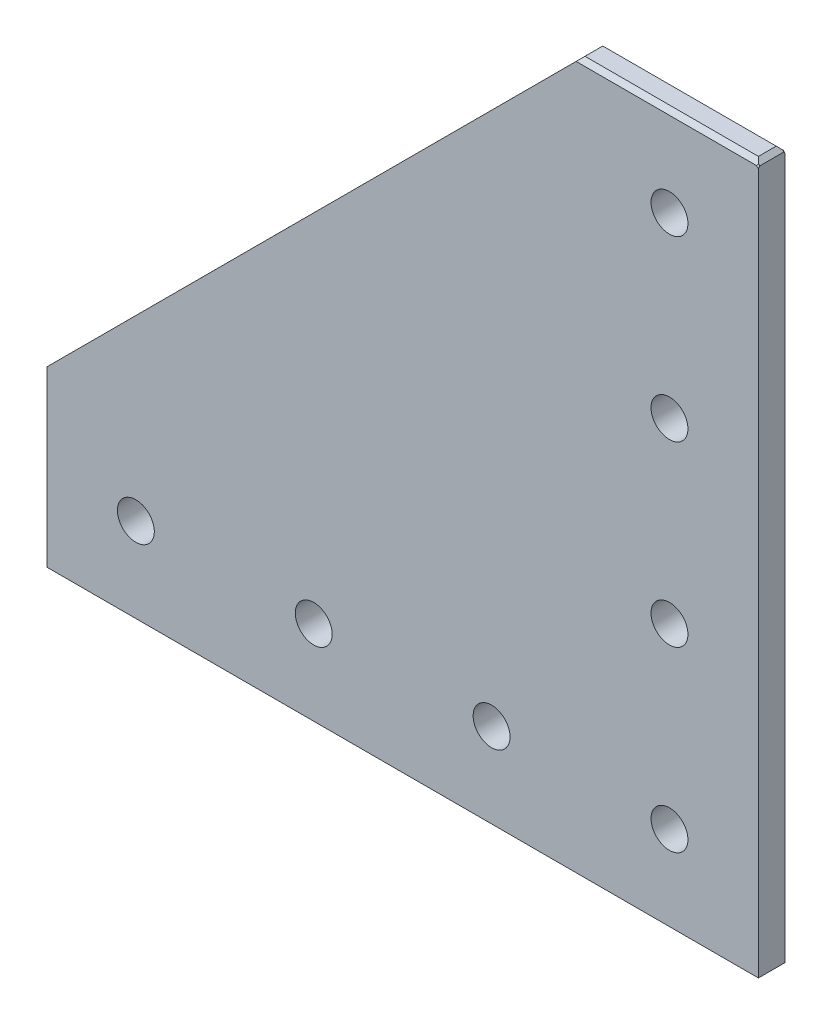
ISO-10303-21;
HEADER;
FILE_DESCRIPTION(('STEP AP214'),'2;1');
FILE_NAME('part.step','',(''),(''),'','','');
FILE_SCHEMA(('AUTOMOTIVE_DESIGN { 1 0 10303 214 1 1 1 1 }'));
ENDSEC;
DATA;
#1=APPLICATION_CONTEXT('core data for automotive mechanical design processes');
#2=APPLICATION_PROTOCOL_DEFINITION('international standard','automotive_design',2000,#1);
#3=PRODUCT_CONTEXT('',#1,'mechanical');
#4=PRODUCT('Part','Part','',(#3));
#5=PRODUCT_RELATED_PRODUCT_CATEGORY('part','',(#4));
#6=PRODUCT_DEFINITION_FORMATION('','',#4);
#7=PRODUCT_DEFINITION_CONTEXT('part definition',#1,'design');
#8=PRODUCT_DEFINITION('design','',#6,#7);
#9=PRODUCT_DEFINITION_SHAPE('','',#8);
#10=(LENGTH_UNIT() NAMED_UNIT(*) SI_UNIT(.MILLI.,.METRE.));
#11=(NAMED_UNIT(*) PLANE_ANGLE_UNIT() SI_UNIT($,.RADIAN.));
#12=(NAMED_UNIT(*) SI_UNIT($,.STERADIAN.) SOLID_ANGLE_UNIT());
#13=UNCERTAINTY_MEASURE_WITH_UNIT(LENGTH_MEASURE(1.E-05),#10,'distance_accuracy_value','');
#14=(GEOMETRIC_REPRESENTATION_CONTEXT(3) GLOBAL_UNCERTAINTY_ASSIGNED_CONTEXT((#13)) GLOBAL_UNIT_ASSIGNED_CONTEXT((#10,
#11,#12)) REPRESENTATION_CONTEXT('',''));
#15=CARTESIAN_POINT('',(0.,0.,0.));
#16=DIRECTION('',(0.,0.,1.));
#17=DIRECTION('',(1.,0.,0.));
#18=AXIS2_PLACEMENT_3D('',#15,#16,#17);
#19=CARTESIAN_POINT('',(-45.214020619,-78.014948454,-0.036));
#20=DIRECTION('',(-0.707106781186547,-0.707106781186547,0.));
#21=DIRECTION('',(0.707106781186547,-0.707106781186547,0.));
#22=AXIS2_PLACEMENT_3D('',#19,#20,#21);
#23=PLANE('',#22);
#24=DIRECTION('',(0.577350269285081,-0.577350269285081,0.577350268998715));
#25=VECTOR('',#24,1.);
#26=CARTESIAN_POINT('',(-45.214020619,-78.014948454,1.48799998337485E-09));
#27=LINE('',#26,#25);
#28=CARTESIAN_POINT('',(-45.214020619,-78.014948454,7.43999952723911E-10));
#29=VERTEX_POINT('',#28);
#30=CARTESIAN_POINT('',(-44.214020619,-79.014948454,1.000000000496));
#31=VERTEX_POINT('',#30);
#32=EDGE_CURVE('E20',#29,#31,#27,.T.);
#33=ORIENTED_EDGE('',*,*,#32,.T.);
#34=DIRECTION('',(0.,0.,1.));
#35=VECTOR('',#34,1.);
#36=CARTESIAN_POINT('',(-44.214020619,-79.014948454,3.));
#37=LINE('',#36,#35);
#38=CARTESIAN_POINT('',(-44.21402062572,-79.014948454,5.));
#39=VERTEX_POINT('',#38);
#40=EDGE_CURVE('E227',#31,#39,#37,.T.);
#41=ORIENTED_EDGE('',*,*,#40,.T.);
#42=DIRECTION('',(0.57735024874373,-0.577350279412574,-0.577350279412573));
#43=VECTOR('',#42,1.);
#44=CARTESIAN_POINT('',(-45.21402057932,-78.014948454,6.));
#45=LINE('',#44,#43);
#46=CARTESIAN_POINT('',(-45.21402059916,-78.014948454,6.));
#47=VERTEX_POINT('',#46);
#48=EDGE_CURVE('E214',#47,#39,#45,.T.);
#49=ORIENTED_EDGE('',*,*,#48,.F.);
#50=DIRECTION('',(0.,0.,1.));
#51=VECTOR('',#50,1.);
#52=CARTESIAN_POINT('',(-45.214020619,-78.014948454,3.));
#53=LINE('',#52,#51);
#54=EDGE_CURVE('E211',#29,#47,#53,.T.);
#55=ORIENTED_EDGE('',*,*,#54,.F.);
#56=EDGE_LOOP('',(#33,#41,#49,#55));
#57=FACE_BOUND('',#56,.T.);
#58=ADVANCED_FACE('F16',(#57),#23,.T.);
#59=CARTESIAN_POINT('',(-44.214020619,-79.014948454,1.));
#60=DIRECTION('',(0.,1.,0.));
#61=DIRECTION('',(0.,0.,1.));
#62=AXIS2_PLACEMENT_3D('',#59,#60,#61);
#63=PLANE('',#62);
#64=DIRECTION('',(0.,0.,1.));
#65=VECTOR('',#64,1.);
#66=CARTESIAN_POINT('',(113.785979381,-79.014948454,3.));
#67=LINE('',#66,#65);
#68=CARTESIAN_POINT('',(113.785979381,-79.014948454,1.00000000336001));
#69=VERTEX_POINT('',#68);
#70=CARTESIAN_POINT('',(113.78597938772,-79.014948454,5.));
#71=VERTEX_POINT('',#70);
#72=EDGE_CURVE('E221',#69,#71,#67,.T.);
#73=ORIENTED_EDGE('',*,*,#72,.T.);
#74=DIRECTION('',(1.,0.,0.));
#75=VECTOR('',#74,1.);
#76=CARTESIAN_POINT('',(34.785979381,-79.014948454,5.));
#77=LINE('',#76,#75);
#78=EDGE_CURVE('E219',#39,#71,#77,.T.);
#79=ORIENTED_EDGE('',*,*,#78,.F.);
#80=ORIENTED_EDGE('',*,*,#40,.F.);
#81=DIRECTION('',(1.,0.,0.));
#82=VECTOR('',#81,1.);
#83=CARTESIAN_POINT('',(34.785979381,-79.014948454,1.));
#84=LINE('',#83,#82);
#85=EDGE_CURVE('E208',#31,#69,#84,.T.);
#86=ORIENTED_EDGE('',*,*,#85,.T.);
#87=EDGE_LOOP('',(#73,#79,#80,#86));
#88=FACE_BOUND('',#87,.T.);
#89=ADVANCED_FACE('F261',(#88),#63,.F.);
#90=CARTESIAN_POINT('',(114.785979381,79.985051546,0.292893219));
#91=DIRECTION('',(0.707106781186547,0.707106781186547,0.));
#92=DIRECTION('',(-0.707106781186547,0.707106781186547,0.));
#93=AXIS2_PLACEMENT_3D('',#90,#91,#92);
#94=PLANE('',#93);
#95=DIRECTION('',(0.,0.,-1.));
#96=VECTOR('',#95,1.);
#97=CARTESIAN_POINT('',(113.785979381,80.985051546,3.));
#98=LINE('',#97,#96);
#99=CARTESIAN_POINT('',(113.785979381,80.985051546,4.9999999996406));
#100=VERTEX_POINT('',#99);
#101=CARTESIAN_POINT('',(113.785979381,80.985051546,0.999999998764435));
#102=VERTEX_POINT('',#101);
#103=EDGE_CURVE('E126',#100,#102,#98,.T.);
#104=ORIENTED_EDGE('',*,*,#103,.F.);
#105=DIRECTION('',(0.57735026913008,-0.57735026913008,0.577350269308717));
#106=VECTOR('',#105,1.);
#107=CARTESIAN_POINT('',(113.785979381719,80.9850515452812,5.));
#108=LINE('',#107,#106);
#109=CARTESIAN_POINT('',(114.493086162554,80.2779447647524,5.70710678123311));
#110=VERTEX_POINT('',#109);
#111=EDGE_CURVE('E122',#100,#110,#108,.T.);
#112=ORIENTED_EDGE('',*,*,#111,.T.);
#113=DIRECTION('',(-0.707106781266203,0.707106781106892,1.5289734027514E-10));
#114=VECTOR('',#113,1.);
#115=CARTESIAN_POINT('',(114.785979381258,79.9850515462169,5.70710678116977));
#116=LINE('',#115,#114);
#117=CARTESIAN_POINT('',(114.785979380339,79.9850515466783,5.70710678164939));
#118=VERTEX_POINT('',#117);
#119=EDGE_CURVE('E212',#118,#110,#116,.T.);
#120=ORIENTED_EDGE('',*,*,#119,.F.);
#121=DIRECTION('',(0.,0.,-1.));
#122=VECTOR('',#121,1.);
#123=CARTESIAN_POINT('',(114.785979381,79.985051546,3.));
#124=LINE('',#123,#122);
#125=CARTESIAN_POINT('',(114.785979381,79.985051546,0.292893218839367));
#126=VERTEX_POINT('',#125);
#127=EDGE_CURVE('E204',#118,#126,#124,.T.);
#128=ORIENTED_EDGE('',*,*,#127,.T.);
#129=DIRECTION('',(-0.707106781186547,0.707106781186547,0.));
#130=VECTOR('',#129,1.);
#131=CARTESIAN_POINT('',(114.285979381,80.485051546,0.292893219));
#132=LINE('',#131,#130);
#133=CARTESIAN_POINT('',(114.493086162354,80.2779447646464,0.292893218646441));
#134=VERTEX_POINT('',#133);
#135=EDGE_CURVE('E222',#126,#134,#132,.T.);
#136=ORIENTED_EDGE('',*,*,#135,.T.);
#137=DIRECTION('',(-0.577350269862182,0.577350269862182,0.577350267844513));
#138=VECTOR('',#137,1.);
#139=CARTESIAN_POINT('',(114.493086162,80.277944765,0.292893219));
#140=LINE('',#139,#138);
#141=EDGE_CURVE('E220',#134,#102,#140,.T.);
#142=ORIENTED_EDGE('',*,*,#141,.T.);
#143=EDGE_LOOP('',(#104,#112,#120,#128,#136,#142));
#144=FACE_BOUND('',#143,.T.);
#145=ADVANCED_FACE('F335',(#144),#94,.T.);
#146=CARTESIAN_POINT('',(114.785979381,-78.014948454,-0.036));
#147=DIRECTION('',(-0.707106781186547,0.707106781186547,0.));
#148=DIRECTION('',(-0.707106781186547,-0.707106781186547,0.));
#149=AXIS2_PLACEMENT_3D('',#146,#147,#148);
#150=PLANE('',#149);
#151=DIRECTION('',(0.,0.,1.));
#152=VECTOR('',#151,1.);
#153=CARTESIAN_POINT('',(114.785979381,-78.014948454,3.));
#154=LINE('',#153,#152);
#155=CARTESIAN_POINT('',(114.785979381,-78.014948454,-9.91999548911188E-09));
#156=VERTEX_POINT('',#155);
#157=CARTESIAN_POINT('',(114.78597936116,-78.014948454,6.));
#158=VERTEX_POINT('',#157);
#159=EDGE_CURVE('E200',#156,#158,#154,.T.);
#160=ORIENTED_EDGE('',*,*,#159,.T.);
#161=DIRECTION('',(0.577350248743725,0.577350279412576,0.577350279412576));
#162=VECTOR('',#161,1.);
#163=CARTESIAN_POINT('',(113.78597939444,-79.014948454,5.));
#164=LINE('',#163,#162);
#165=EDGE_CURVE('E217',#71,#158,#164,.T.);
#166=ORIENTED_EDGE('',*,*,#165,.F.);
#167=ORIENTED_EDGE('',*,*,#72,.F.);
#168=DIRECTION('',(0.577350264078151,0.577350264078151,-0.577350279412576));
#169=VECTOR('',#168,1.);
#170=CARTESIAN_POINT('',(113.78597938772,-79.01494844728,1.));
#171=LINE('',#170,#169);
#172=EDGE_CURVE('E205',#69,#156,#171,.T.);
#173=ORIENTED_EDGE('',*,*,#172,.T.);
#174=EDGE_LOOP('',(#160,#166,#167,#173));
#175=FACE_BOUND('',#174,.T.);
#176=ADVANCED_FACE('F285',(#175),#150,.F.);
#177=CARTESIAN_POINT('',(74.785979381,80.985051546,1.));
#178=DIRECTION('',(0.,1.,0.));
#179=DIRECTION('',(0.,0.,1.));
#180=AXIS2_PLACEMENT_3D('',#177,#178,#179);
#181=PLANE('',#180);
#182=ORIENTED_EDGE('',*,*,#103,.T.);
#183=DIRECTION('',(1.,0.,0.));
#184=VECTOR('',#183,1.);
#185=CARTESIAN_POINT('',(94.139455642,80.985051546,1.));
#186=LINE('',#185,#184);
#187=CARTESIAN_POINT('',(74.7859793804999,80.985051546,1.));
#188=VERTEX_POINT('',#187);
#189=EDGE_CURVE('E136',#188,#102,#186,.T.);
#190=ORIENTED_EDGE('',*,*,#189,.F.);
#191=DIRECTION('',(0.,0.,1.));
#192=VECTOR('',#191,1.);
#193=CARTESIAN_POINT('',(74.785979381,80.985051546,3.));
#194=LINE('',#193,#192);
#195=CARTESIAN_POINT('',(74.7859793804999,80.985051546,5.));
#196=VERTEX_POINT('',#195);
#197=EDGE_CURVE('E129',#188,#196,#194,.T.);
#198=ORIENTED_EDGE('',*,*,#197,.T.);
#199=DIRECTION('',(1.,0.,0.));
#200=VECTOR('',#199,1.);
#201=CARTESIAN_POINT('',(94.139455642,80.985051546,5.));
#202=LINE('',#201,#200);
#203=EDGE_CURVE('E114',#196,#100,#202,.T.);
#204=ORIENTED_EDGE('',*,*,#203,.T.);
#205=EDGE_LOOP('',(#182,#190,#198,#204));
#206=FACE_BOUND('',#205,.T.);
#207=ADVANCED_FACE('F134',(#206),#181,.T.);
#208=CARTESIAN_POINT('',(73.785825121,79.985051546,6.));
#209=DIRECTION('',(0.,-0.707106781186547,-0.707106781186548));
#210=DIRECTION('',(0.,0.707106781186548,-0.707106781186547));
#211=AXIS2_PLACEMENT_3D('',#208,#209,#210);
#212=PLANE('',#211);
#213=DIRECTION('',(-1.,0.,0.));
#214=VECTOR('',#213,1.);
#215=CARTESIAN_POINT('',(34.785979381,79.985051546,6.));
#216=LINE('',#215,#214);
#217=CARTESIAN_POINT('',(114.37176580016,79.9850515460686,6.00000000006861));
#218=VERTEX_POINT('',#217);
#219=CARTESIAN_POINT('',(73.7858251259561,79.985051546,6.));
#220=VERTEX_POINT('',#219);
#221=EDGE_CURVE('E144',#218,#220,#216,.T.);
#222=ORIENTED_EDGE('',*,*,#221,.F.);
#223=DIRECTION('',(-0.281084636299855,-0.678598344630526,0.678598345047266));
#224=VECTOR('',#223,1.);
#225=CARTESIAN_POINT('',(114.493086162273,80.2779447651359,5.7071067812331));
#226=LINE('',#225,#224);
#227=EDGE_CURVE('E209',#110,#218,#226,.T.);
#228=ORIENTED_EDGE('',*,*,#227,.F.);
#229=ORIENTED_EDGE('',*,*,#111,.F.);
#230=ORIENTED_EDGE('',*,*,#203,.F.);
#231=DIRECTION('',(-0.577409642809244,-0.577320580089998,0.577320580089996));
#232=VECTOR('',#231,1.);
#233=CARTESIAN_POINT('',(74.785979381,80.985051547,4.999999999));
#234=LINE('',#233,#232);
#235=EDGE_CURVE('E118',#196,#220,#234,.T.);
#236=ORIENTED_EDGE('',*,*,#235,.T.);
#237=EDGE_LOOP('',(#222,#228,#229,#230,#236));
#238=FACE_BOUND('',#237,.T.);
#239=ADVANCED_FACE('F117',(#238),#212,.F.);
#240=CARTESIAN_POINT('',(-46.174020619,-78.014948454,6.));
#241=DIRECTION('',(0.,-0.707106781186547,0.707106781186548));
#242=DIRECTION('',(0.,-0.707106781186548,-0.707106781186547));
#243=AXIS2_PLACEMENT_3D('',#240,#241,#242);
#244=PLANE('',#243);
#245=DIRECTION('',(1.,0.,0.));
#246=VECTOR('',#245,1.);
#247=CARTESIAN_POINT('',(34.785979381,-78.014948454,6.));
#248=LINE('',#247,#246);
#249=EDGE_CURVE('E238',#47,#158,#248,.T.);
#250=ORIENTED_EDGE('',*,*,#249,.F.);
#251=ORIENTED_EDGE('',*,*,#48,.T.);
#252=ORIENTED_EDGE('',*,*,#78,.T.);
#253=ORIENTED_EDGE('',*,*,#165,.T.);
#254=EDGE_LOOP('',(#250,#251,#252,#253));
#255=FACE_BOUND('',#254,.T.);
#256=ADVANCED_FACE('F287',(#255),#244,.T.);
#257=CARTESIAN_POINT('',(114.689419376,80.282187406,5.565278234));
#258=DIRECTION('',(0.500000000555556,0.500000000515327,0.707106780429319));
#259=DIRECTION('',(-0.816496580333862,0.,0.577350270029476));
#260=AXIS2_PLACEMENT_3D('',#257,#258,#259);
#261=PLANE('',#260);
#262=ORIENTED_EDGE('',*,*,#227,.T.);
#263=DIRECTION('',(-0.707106789722082,0.707106772651014,0.));
#264=VECTOR('',#263,1.);
#265=CARTESIAN_POINT('',(114.785979381,79.570837956,6.));
#266=LINE('',#265,#264);
#267=CARTESIAN_POINT('',(114.785979382809,79.5708379668556,6.));
#268=VERTEX_POINT('',#267);
#269=EDGE_CURVE('E190',#268,#218,#266,.T.);
#270=ORIENTED_EDGE('',*,*,#269,.F.);
#271=DIRECTION('',(-1.60042415972101E-08,0.816496585690512,-0.577350262454029));
#272=VECTOR('',#271,1.);
#273=CARTESIAN_POINT('',(114.785979388237,79.5708379632371,6.00000001023475));
#274=LINE('',#273,#272);
#275=EDGE_CURVE('E201',#268,#118,#274,.T.);
#276=ORIENTED_EDGE('',*,*,#275,.T.);
#277=ORIENTED_EDGE('',*,*,#119,.T.);
#278=EDGE_LOOP('',(#262,#270,#276,#277));
#279=FACE_BOUND('',#278,.T.);
#280=ADVANCED_FACE('F281',(#279),#261,.T.);
#281=CARTESIAN_POINT('',(-45.214020619,-78.014948454,0.));
#282=DIRECTION('',(-1.,0.,0.));
#283=DIRECTION('',(0.,0.,1.));
#284=AXIS2_PLACEMENT_3D('',#281,#282,#283);
#285=PLANE('',#284);
#286=ORIENTED_EDGE('',*,*,#54,.T.);
#287=DIRECTION('',(0.,-1.,0.));
#288=VECTOR('',#287,1.);
#289=CARTESIAN_POINT('',(-45.214020619,0.985051545999996,6.));
#290=LINE('',#289,#288);
#291=CARTESIAN_POINT('',(-45.214020619,-38.996440056,6.));
#292=VERTEX_POINT('',#291);
#293=EDGE_CURVE('E194',#292,#47,#290,.T.);
#294=ORIENTED_EDGE('',*,*,#293,.F.);
#295=DIRECTION('',(0.,0.,-1.));
#296=VECTOR('',#295,1.);
#297=CARTESIAN_POINT('',(-45.214020619,-38.996440088,3.));
#298=LINE('',#297,#296);
#299=CARTESIAN_POINT('',(-45.214020619,-38.996440088,0.));
#300=VERTEX_POINT('',#299);
#301=EDGE_CURVE('E132',#292,#300,#298,.T.);
#302=ORIENTED_EDGE('',*,*,#301,.T.);
#303=DIRECTION('',(0.,-1.,0.));
#304=VECTOR('',#303,1.);
#305=CARTESIAN_POINT('',(-45.214020619,0.985051545999996,0.));
#306=LINE('',#305,#304);
#307=EDGE_CURVE('E105',#300,#29,#306,.T.);
#308=ORIENTED_EDGE('',*,*,#307,.T.);
#309=EDGE_LOOP('',(#286,#294,#302,#308));
#310=FACE_BOUND('',#309,.T.);
#311=ADVANCED_FACE('F270',(#310),#285,.T.);
#312=CARTESIAN_POINT('',(-46.174020619,-78.014948454,0.));
#313=DIRECTION('',(0.,0.707106781186547,0.707106781186548));
#314=DIRECTION('',(0.,-0.707106781186548,0.707106781186547));
#315=AXIS2_PLACEMENT_3D('',#312,#313,#314);
#316=PLANE('',#315);
#317=ORIENTED_EDGE('',*,*,#172,.F.);
#318=ORIENTED_EDGE('',*,*,#85,.F.);
#319=ORIENTED_EDGE('',*,*,#32,.F.);
#320=DIRECTION('',(1.,0.,0.));
#321=VECTOR('',#320,1.);
#322=CARTESIAN_POINT('',(34.785979381,-78.014948454,0.));
#323=LINE('',#322,#321);
#324=EDGE_CURVE('E249',#29,#156,#323,.T.);
#325=ORIENTED_EDGE('',*,*,#324,.T.);
#326=EDGE_LOOP('',(#317,#318,#319,#325));
#327=FACE_BOUND('',#326,.T.);
#328=ADVANCED_FACE('F264',(#327),#316,.F.);
#329=CARTESIAN_POINT('',(114.785979381,-78.014948454,0.));
#330=DIRECTION('',(-1.,0.,0.));
#331=DIRECTION('',(0.,0.,1.));
#332=AXIS2_PLACEMENT_3D('',#329,#330,#331);
#333=PLANE('',#332);
#334=ORIENTED_EDGE('',*,*,#159,.F.);
#335=DIRECTION('',(0.,1.,0.));
#336=VECTOR('',#335,1.);
#337=CARTESIAN_POINT('',(114.785979381,0.985051545999996,0.));
#338=LINE('',#337,#336);
#339=CARTESIAN_POINT('',(114.785979381064,79.5708379770083,-5.02701323886911E-09));
#340=VERTEX_POINT('',#339);
#341=EDGE_CURVE('E171',#156,#340,#338,.T.);
#342=ORIENTED_EDGE('',*,*,#341,.T.);
#343=DIRECTION('',(0.,0.816496580856449,0.577350269290426));
#344=VECTOR('',#343,1.);
#345=CARTESIAN_POINT('',(114.785979381,79.5708379838651,-4.30068730871954E-11));
#346=LINE('',#345,#344);
#347=EDGE_CURVE('E197',#340,#126,#346,.T.);
#348=ORIENTED_EDGE('',*,*,#347,.T.);
#349=ORIENTED_EDGE('',*,*,#127,.F.);
#350=ORIENTED_EDGE('',*,*,#275,.F.);
#351=DIRECTION('',(0.,1.,0.));
#352=VECTOR('',#351,1.);
#353=CARTESIAN_POINT('',(114.785979381,0.985051545999996,6.));
#354=LINE('',#353,#352);
#355=EDGE_CURVE('E193',#158,#268,#354,.T.);
#356=ORIENTED_EDGE('',*,*,#355,.F.);
#357=EDGE_LOOP('',(#334,#342,#348,#349,#350,#356));
#358=FACE_BOUND('',#357,.T.);
#359=ADVANCED_FACE('F277',(#358),#333,.F.);
#360=CARTESIAN_POINT('',(114.689419376,80.282187406,0.434721766));
#361=DIRECTION('',(-0.500000000555556,-0.500000000515327,0.707106780429319));
#362=DIRECTION('',(-0.816496580333862,0.,-0.577350270029476));
#363=AXIS2_PLACEMENT_3D('',#360,#361,#362);
#364=PLANE('',#363);
#365=ORIENTED_EDGE('',*,*,#135,.F.);
#366=ORIENTED_EDGE('',*,*,#347,.F.);
#367=DIRECTION('',(-0.707106785440088,0.707106776933007,-6.05565015488946E-09));
#368=VECTOR('',#367,1.);
#369=CARTESIAN_POINT('',(114.785979388237,79.5708379632371,-1.02347482160321E-08));
#370=LINE('',#369,#368);
#371=CARTESIAN_POINT('',(114.37176581246,79.985051546,-3.44551667145939E-09));
#372=VERTEX_POINT('',#371);
#373=EDGE_CURVE('E168',#340,#372,#370,.T.);
#374=ORIENTED_EDGE('',*,*,#373,.T.);
#375=DIRECTION('',(-0.281084626904209,-0.678598346784799,-0.678598346784797));
#376=VECTOR('',#375,1.);
#377=CARTESIAN_POINT('',(114.493086163,80.277944765,0.292893219000001));
#378=LINE('',#377,#376);
#379=EDGE_CURVE('E138',#134,#372,#378,.T.);
#380=ORIENTED_EDGE('',*,*,#379,.F.);
#381=EDGE_LOOP('',(#365,#366,#374,#380));
#382=FACE_BOUND('',#381,.T.);
#383=ADVANCED_FACE('F275',(#382),#364,.F.);
#384=CARTESIAN_POINT('',(73.785825121,79.985051546,0.));
#385=DIRECTION('',(0.,0.707106781186547,-0.707106781186548));
#386=DIRECTION('',(0.,0.707106781186548,0.707106781186547));
#387=AXIS2_PLACEMENT_3D('',#384,#385,#386);
#388=PLANE('',#387);
#389=ORIENTED_EDGE('',*,*,#379,.T.);
#390=DIRECTION('',(-1.,0.,0.));
#391=VECTOR('',#390,1.);
#392=CARTESIAN_POINT('',(34.785979381,79.985051546,0.));
#393=LINE('',#392,#391);
#394=CARTESIAN_POINT('',(73.7858251158681,79.985051546,0.));
#395=VERTEX_POINT('',#394);
#396=EDGE_CURVE('E142',#372,#395,#393,.T.);
#397=ORIENTED_EDGE('',*,*,#396,.T.);
#398=DIRECTION('',(0.577409642809244,0.577320580089998,0.577320580089996));
#399=VECTOR('',#398,1.);
#400=CARTESIAN_POINT('',(73.785825101,79.9850515360895,-9.91054460719453E-09));
#401=LINE('',#400,#399);
#402=EDGE_CURVE('E35',#395,#188,#401,.T.);
#403=ORIENTED_EDGE('',*,*,#402,.T.);
#404=ORIENTED_EDGE('',*,*,#189,.T.);
#405=ORIENTED_EDGE('',*,*,#141,.F.);
#406=EDGE_LOOP('',(#389,#397,#403,#404,#405));
#407=FACE_BOUND('',#406,.T.);
#408=ADVANCED_FACE('F273',(#407),#388,.T.);
#409=CARTESIAN_POINT('',(-45.214020619,-38.996440088,0.));
#410=DIRECTION('',(0.707052244081806,-0.707161314085324,0.));
#411=DIRECTION('',(0.707161314085324,0.707052244081806,0.));
#412=AXIS2_PLACEMENT_3D('',#409,#410,#411);
#413=PLANE('',#412);
#414=DIRECTION('',(-0.707161314335424,-0.707052243831667,0.));
#415=VECTOR('',#414,1.);
#416=CARTESIAN_POINT('',(73.7858251410001,79.985051546,6.));
#417=LINE('',#416,#415);
#418=EDGE_CURVE('E131',#220,#292,#417,.T.);
#419=ORIENTED_EDGE('',*,*,#418,.F.);
#420=ORIENTED_EDGE('',*,*,#235,.F.);
#421=ORIENTED_EDGE('',*,*,#197,.F.);
#422=ORIENTED_EDGE('',*,*,#402,.F.);
#423=DIRECTION('',(0.707161314085324,0.707052244081806,0.));
#424=VECTOR('',#423,1.);
#425=CARTESIAN_POINT('',(-45.214020619,-38.996440088,0.));
#426=LINE('',#425,#424);
#427=EDGE_CURVE('E166',#395,#300,#426,.F.);
#428=ORIENTED_EDGE('',*,*,#427,.T.);
#429=ORIENTED_EDGE('',*,*,#301,.F.);
#430=EDGE_LOOP('',(#419,#420,#421,#422,#428,#429));
#431=FACE_BOUND('',#430,.T.);
#432=ADVANCED_FACE('F128',(#431),#413,.F.);
#433=CARTESIAN_POINT('',(-25.214020619,-59.014948454,6.));
#434=DIRECTION('',(0.,0.,-1.));
#435=DIRECTION('',(-1.,0.,0.));
#436=AXIS2_PLACEMENT_3D('',#433,#434,#435);
#437=CYLINDRICAL_SURFACE('',#436,4.15);
#438=CARTESIAN_POINT('',(-25.214020619,-59.014948454,0.));
#439=DIRECTION('',(0.,0.,-1.));
#440=DIRECTION('',(-1.,0.,0.));
#441=AXIS2_PLACEMENT_3D('',#438,#439,#440);
#442=CIRCLE('',#441,4.15);
#443=CARTESIAN_POINT('',(-29.364020619,-59.014948454,0.));
#444=VERTEX_POINT('',#443);
#445=EDGE_CURVE('E163',#444,#444,#442,.T.);
#446=ORIENTED_EDGE('',*,*,#445,.T.);
#447=EDGE_LOOP('',(#446));
#448=FACE_BOUND('',#447,.T.);
#449=CARTESIAN_POINT('',(-25.214020619,-59.014948454,6.));
#450=DIRECTION('',(0.,0.,-1.));
#451=DIRECTION('',(-1.,0.,0.));
#452=AXIS2_PLACEMENT_3D('',#449,#450,#451);
#453=CIRCLE('',#452,4.15);
#454=CARTESIAN_POINT('',(-29.364020619,-59.014948454,6.));
#455=VERTEX_POINT('',#454);
#456=EDGE_CURVE('E187',#455,#455,#453,.T.);
#457=ORIENTED_EDGE('',*,*,#456,.F.);
#458=EDGE_LOOP('',(#457));
#459=FACE_BOUND('',#458,.T.);
#460=ADVANCED_FACE('F326',(#448,#459),#437,.F.);
#461=CARTESIAN_POINT('',(54.785979381,-59.014948454,6.));
#462=DIRECTION('',(0.,0.,-1.));
#463=DIRECTION('',(-1.,0.,0.));
#464=AXIS2_PLACEMENT_3D('',#461,#462,#463);
#465=CYLINDRICAL_SURFACE('',#464,4.15);
#466=CARTESIAN_POINT('',(54.785979381,-59.014948454,0.));
#467=DIRECTION('',(0.,0.,-1.));
#468=DIRECTION('',(-1.,0.,0.));
#469=AXIS2_PLACEMENT_3D('',#466,#467,#468);
#470=CIRCLE('',#469,4.15);
#471=CARTESIAN_POINT('',(50.635979381,-59.014948454,0.));
#472=VERTEX_POINT('',#471);
#473=EDGE_CURVE('E160',#472,#472,#470,.T.);
#474=ORIENTED_EDGE('',*,*,#473,.T.);
#475=EDGE_LOOP('',(#474));
#476=FACE_BOUND('',#475,.T.);
#477=CARTESIAN_POINT('',(54.785979381,-59.014948454,6.));
#478=DIRECTION('',(0.,0.,-1.));
#479=DIRECTION('',(-1.,0.,0.));
#480=AXIS2_PLACEMENT_3D('',#477,#478,#479);
#481=CIRCLE('',#480,4.15);
#482=CARTESIAN_POINT('',(50.635979381,-59.014948454,6.));
#483=VERTEX_POINT('',#482);
#484=EDGE_CURVE('E184',#483,#483,#481,.T.);
#485=ORIENTED_EDGE('',*,*,#484,.F.);
#486=EDGE_LOOP('',(#485));
#487=FACE_BOUND('',#486,.T.);
#488=ADVANCED_FACE('F322',(#476,#487),#465,.F.);
#489=CARTESIAN_POINT('',(14.785979381,-59.014948454,6.));
#490=DIRECTION('',(0.,0.,-1.));
#491=DIRECTION('',(-1.,0.,0.));
#492=AXIS2_PLACEMENT_3D('',#489,#490,#491);
#493=CYLINDRICAL_SURFACE('',#492,4.15);
#494=CARTESIAN_POINT('',(14.785979381,-59.014948454,0.));
#495=DIRECTION('',(0.,0.,-1.));
#496=DIRECTION('',(-1.,0.,0.));
#497=AXIS2_PLACEMENT_3D('',#494,#495,#496);
#498=CIRCLE('',#497,4.15);
#499=CARTESIAN_POINT('',(10.635979381,-59.014948454,0.));
#500=VERTEX_POINT('',#499);
#501=EDGE_CURVE('E157',#500,#500,#498,.T.);
#502=ORIENTED_EDGE('',*,*,#501,.T.);
#503=EDGE_LOOP('',(#502));
#504=FACE_BOUND('',#503,.T.);
#505=CARTESIAN_POINT('',(14.785979381,-59.014948454,6.));
#506=DIRECTION('',(0.,0.,-1.));
#507=DIRECTION('',(-1.,0.,0.));
#508=AXIS2_PLACEMENT_3D('',#505,#506,#507);
#509=CIRCLE('',#508,4.15);
#510=CARTESIAN_POINT('',(10.635979381,-59.014948454,6.));
#511=VERTEX_POINT('',#510);
#512=EDGE_CURVE('E181',#511,#511,#509,.T.);
#513=ORIENTED_EDGE('',*,*,#512,.F.);
#514=EDGE_LOOP('',(#513));
#515=FACE_BOUND('',#514,.T.);
#516=ADVANCED_FACE('F318',(#504,#515),#493,.F.);
#517=CARTESIAN_POINT('',(94.785979381,20.985051546,6.));
#518=DIRECTION('',(0.,0.,-1.));
#519=DIRECTION('',(-1.,0.,0.));
#520=AXIS2_PLACEMENT_3D('',#517,#518,#519);
#521=CYLINDRICAL_SURFACE('',#520,4.15000000000001);
#522=CARTESIAN_POINT('',(94.785979381,20.985051546,6.));
#523=DIRECTION('',(0.,0.,-1.));
#524=DIRECTION('',(-1.,0.,0.));
#525=AXIS2_PLACEMENT_3D('',#522,#523,#524);
#526=CIRCLE('',#525,4.15000000000001);
#527=CARTESIAN_POINT('',(90.635979381,20.985051546,6.));
#528=VERTEX_POINT('',#527);
#529=EDGE_CURVE('E178',#528,#528,#526,.T.);
#530=ORIENTED_EDGE('',*,*,#529,.F.);
#531=EDGE_LOOP('',(#530));
#532=FACE_BOUND('',#531,.T.);
#533=CARTESIAN_POINT('',(94.785979381,20.985051546,0.));
#534=DIRECTION('',(0.,0.,-1.));
#535=DIRECTION('',(-1.,0.,0.));
#536=AXIS2_PLACEMENT_3D('',#533,#534,#535);
#537=CIRCLE('',#536,4.15000000000001);
#538=CARTESIAN_POINT('',(90.635979381,20.985051546,0.));
#539=VERTEX_POINT('',#538);
#540=EDGE_CURVE('E154',#539,#539,#537,.T.);
#541=ORIENTED_EDGE('',*,*,#540,.T.);
#542=EDGE_LOOP('',(#541));
#543=FACE_BOUND('',#542,.T.);
#544=ADVANCED_FACE('F314',(#532,#543),#521,.F.);
#545=CARTESIAN_POINT('',(94.785979381,-19.014948454,6.));
#546=DIRECTION('',(0.,0.,-1.));
#547=DIRECTION('',(-1.,0.,0.));
#548=AXIS2_PLACEMENT_3D('',#545,#546,#547);
#549=CYLINDRICAL_SURFACE('',#548,4.15000000000001);
#550=CARTESIAN_POINT('',(94.785979381,-19.014948454,6.));
#551=DIRECTION('',(0.,0.,-1.));
#552=DIRECTION('',(-1.,0.,0.));
#553=AXIS2_PLACEMENT_3D('',#550,#551,#552);
#554=CIRCLE('',#553,4.15000000000001);
#555=CARTESIAN_POINT('',(90.635979381,-19.014948454,6.));
#556=VERTEX_POINT('',#555);
#557=EDGE_CURVE('E175',#556,#556,#554,.T.);
#558=ORIENTED_EDGE('',*,*,#557,.F.);
#559=EDGE_LOOP('',(#558));
#560=FACE_BOUND('',#559,.T.);
#561=CARTESIAN_POINT('',(94.785979381,-19.014948454,0.));
#562=DIRECTION('',(0.,0.,-1.));
#563=DIRECTION('',(-1.,0.,0.));
#564=AXIS2_PLACEMENT_3D('',#561,#562,#563);
#565=CIRCLE('',#564,4.15000000000001);
#566=CARTESIAN_POINT('',(90.635979381,-19.014948454,0.));
#567=VERTEX_POINT('',#566);
#568=EDGE_CURVE('E151',#567,#567,#565,.T.);
#569=ORIENTED_EDGE('',*,*,#568,.T.);
#570=EDGE_LOOP('',(#569));
#571=FACE_BOUND('',#570,.T.);
#572=ADVANCED_FACE('F310',(#560,#571),#549,.F.);
#573=CARTESIAN_POINT('',(94.785979381,-59.014948454,6.));
#574=DIRECTION('',(0.,0.,-1.));
#575=DIRECTION('',(-1.,0.,0.));
#576=AXIS2_PLACEMENT_3D('',#573,#574,#575);
#577=CYLINDRICAL_SURFACE('',#576,4.15000000000001);
#578=CARTESIAN_POINT('',(94.785979381,-59.014948454,6.));
#579=DIRECTION('',(0.,0.,-1.));
#580=DIRECTION('',(-1.,0.,0.));
#581=AXIS2_PLACEMENT_3D('',#578,#579,#580);
#582=CIRCLE('',#581,4.15000000000001);
#583=CARTESIAN_POINT('',(90.635979381,-59.014948454,6.));
#584=VERTEX_POINT('',#583);
#585=EDGE_CURVE('E172',#584,#584,#582,.T.);
#586=ORIENTED_EDGE('',*,*,#585,.F.);
#587=EDGE_LOOP('',(#586));
#588=FACE_BOUND('',#587,.T.);
#589=CARTESIAN_POINT('',(94.785979381,-59.014948454,0.));
#590=DIRECTION('',(0.,0.,-1.));
#591=DIRECTION('',(-1.,0.,0.));
#592=AXIS2_PLACEMENT_3D('',#589,#590,#591);
#593=CIRCLE('',#592,4.15000000000001);
#594=CARTESIAN_POINT('',(90.635979381,-59.014948454,0.));
#595=VERTEX_POINT('',#594);
#596=EDGE_CURVE('E148',#595,#595,#593,.T.);
#597=ORIENTED_EDGE('',*,*,#596,.T.);
#598=EDGE_LOOP('',(#597));
#599=FACE_BOUND('',#598,.T.);
#600=ADVANCED_FACE('F307',(#588,#599),#577,.F.);
#601=CARTESIAN_POINT('',(-45.214020619,-78.014948454,6.));
#602=DIRECTION('',(0.,0.,1.));
#603=DIRECTION('',(1.,0.,0.));
#604=AXIS2_PLACEMENT_3D('',#601,#602,#603);
#605=PLANE('',#604);
#606=ORIENTED_EDGE('',*,*,#585,.T.);
#607=EDGE_LOOP('',(#606));
#608=FACE_BOUND('',#607,.T.);
#609=ORIENTED_EDGE('',*,*,#557,.T.);
#610=EDGE_LOOP('',(#609));
#611=FACE_BOUND('',#610,.T.);
#612=ORIENTED_EDGE('',*,*,#529,.T.);
#613=EDGE_LOOP('',(#612));
#614=FACE_BOUND('',#613,.T.);
#615=CARTESIAN_POINT('',(94.785979381,60.985051546,6.));
#616=DIRECTION('',(0.,0.,-1.));
#617=DIRECTION('',(-1.,0.,0.));
#618=AXIS2_PLACEMENT_3D('',#615,#616,#617);
#619=CIRCLE('',#618,4.15000000000001);
#620=CARTESIAN_POINT('',(90.635979381,60.985051546,6.));
#621=VERTEX_POINT('',#620);
#622=EDGE_CURVE('E26',#621,#621,#619,.F.);
#623=ORIENTED_EDGE('',*,*,#622,.F.);
#624=EDGE_LOOP('',(#623));
#625=FACE_BOUND('',#624,.T.);
#626=ORIENTED_EDGE('',*,*,#512,.T.);
#627=EDGE_LOOP('',(#626));
#628=FACE_BOUND('',#627,.T.);
#629=ORIENTED_EDGE('',*,*,#484,.T.);
#630=EDGE_LOOP('',(#629));
#631=FACE_BOUND('',#630,.T.);
#632=ORIENTED_EDGE('',*,*,#456,.T.);
#633=EDGE_LOOP('',(#632));
#634=FACE_BOUND('',#633,.T.);
#635=ORIENTED_EDGE('',*,*,#355,.T.);
#636=ORIENTED_EDGE('',*,*,#269,.T.);
#637=ORIENTED_EDGE('',*,*,#221,.T.);
#638=ORIENTED_EDGE('',*,*,#418,.T.);
#639=ORIENTED_EDGE('',*,*,#293,.T.);
#640=ORIENTED_EDGE('',*,*,#249,.T.);
#641=EDGE_LOOP('',(#635,#636,#637,#638,#639,#640));
#642=FACE_BOUND('',#641,.T.);
#643=ADVANCED_FACE('F283',(#608,#611,#614,#625,#628,#631,#634,#642),#605,.T.);
#644=CARTESIAN_POINT('',(-45.214020619,-78.014948454,0.));
#645=DIRECTION('',(0.,0.,1.));
#646=DIRECTION('',(1.,0.,0.));
#647=AXIS2_PLACEMENT_3D('',#644,#645,#646);
#648=PLANE('',#647);
#649=ORIENTED_EDGE('',*,*,#596,.F.);
#650=EDGE_LOOP('',(#649));
#651=FACE_BOUND('',#650,.T.);
#652=ORIENTED_EDGE('',*,*,#568,.F.);
#653=EDGE_LOOP('',(#652));
#654=FACE_BOUND('',#653,.T.);
#655=ORIENTED_EDGE('',*,*,#540,.F.);
#656=EDGE_LOOP('',(#655));
#657=FACE_BOUND('',#656,.T.);
#658=CARTESIAN_POINT('',(94.785979381,60.985051546,0.));
#659=DIRECTION('',(0.,0.,-1.));
#660=DIRECTION('',(-1.,0.,0.));
#661=AXIS2_PLACEMENT_3D('',#658,#659,#660);
#662=CIRCLE('',#661,4.15000000000001);
#663=CARTESIAN_POINT('',(90.635979381,60.985051546,0.));
#664=VERTEX_POINT('',#663);
#665=EDGE_CURVE('E10',#664,#664,#662,.T.);
#666=ORIENTED_EDGE('',*,*,#665,.F.);
#667=EDGE_LOOP('',(#666));
#668=FACE_BOUND('',#667,.T.);
#669=ORIENTED_EDGE('',*,*,#501,.F.);
#670=EDGE_LOOP('',(#669));
#671=FACE_BOUND('',#670,.T.);
#672=ORIENTED_EDGE('',*,*,#473,.F.);
#673=EDGE_LOOP('',(#672));
#674=FACE_BOUND('',#673,.T.);
#675=ORIENTED_EDGE('',*,*,#445,.F.);
#676=EDGE_LOOP('',(#675));
#677=FACE_BOUND('',#676,.T.);
#678=ORIENTED_EDGE('',*,*,#396,.F.);
#679=ORIENTED_EDGE('',*,*,#373,.F.);
#680=ORIENTED_EDGE('',*,*,#341,.F.);
#681=ORIENTED_EDGE('',*,*,#324,.F.);
#682=ORIENTED_EDGE('',*,*,#307,.F.);
#683=ORIENTED_EDGE('',*,*,#427,.F.);
#684=EDGE_LOOP('',(#678,#679,#680,#681,#682,#683));
#685=FACE_BOUND('',#684,.T.);
#686=ADVANCED_FACE('F18',(#651,#654,#657,#668,#671,#674,#677,#685),#648,.F.);
#687=CARTESIAN_POINT('',(94.785979381,60.985051546,6.));
#688=DIRECTION('',(0.,0.,-1.));
#689=DIRECTION('',(-1.,0.,0.));
#690=AXIS2_PLACEMENT_3D('',#687,#688,#689);
#691=CYLINDRICAL_SURFACE('',#690,4.15000000000001);
#692=ORIENTED_EDGE('',*,*,#665,.T.);
#693=EDGE_LOOP('',(#692));
#694=FACE_BOUND('',#693,.T.);
#695=ORIENTED_EDGE('',*,*,#622,.T.);
#696=EDGE_LOOP('',(#695));
#697=FACE_BOUND('',#696,.T.);
#698=ADVANCED_FACE('F297',(#694,#697),#691,.F.);
#699=CLOSED_SHELL('',(#58,#89,#145,#176,#207,#239,#256,#280,#311,#328,#359,#383,#408,#432,#460,
#488,#516,#544,#572,#600,#643,#686,#698));
#700=MANIFOLD_SOLID_BREP('B1',#699);
#701=ADVANCED_BREP_SHAPE_REPRESENTATION('',(#18,#700),#14);
#702=SHAPE_DEFINITION_REPRESENTATION(#9,#701);
ENDSEC;
END-ISO-10303-21;
